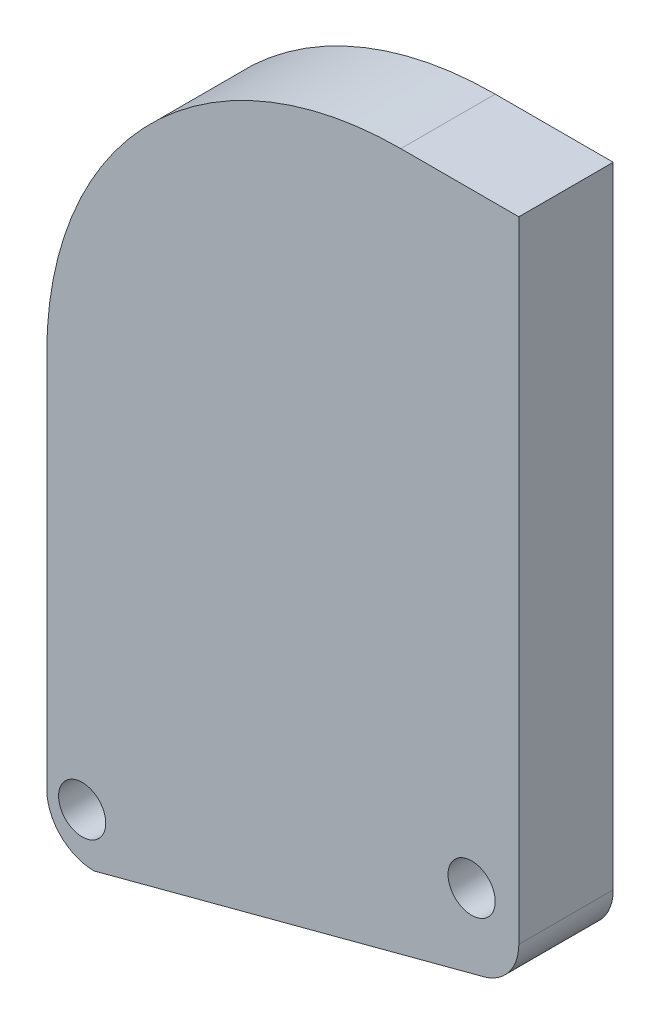
ISO-10303-21;
HEADER;
FILE_DESCRIPTION(('STEP AP214'),'2;1');
FILE_NAME('part.step','',(''),(''),'','','');
FILE_SCHEMA(('AUTOMOTIVE_DESIGN { 1 0 10303 214 1 1 1 1 }'));
ENDSEC;
DATA;
#1=APPLICATION_CONTEXT('core data for automotive mechanical design processes');
#2=APPLICATION_PROTOCOL_DEFINITION('international standard','automotive_design',2000,#1);
#3=PRODUCT_CONTEXT('',#1,'mechanical');
#4=PRODUCT('Part','Part','',(#3));
#5=PRODUCT_RELATED_PRODUCT_CATEGORY('part','',(#4));
#6=PRODUCT_DEFINITION_FORMATION('','',#4);
#7=PRODUCT_DEFINITION_CONTEXT('part definition',#1,'design');
#8=PRODUCT_DEFINITION('design','',#6,#7);
#9=PRODUCT_DEFINITION_SHAPE('','',#8);
#10=(LENGTH_UNIT() NAMED_UNIT(*) SI_UNIT(.MILLI.,.METRE.));
#11=(NAMED_UNIT(*) PLANE_ANGLE_UNIT() SI_UNIT($,.RADIAN.));
#12=(NAMED_UNIT(*) SI_UNIT($,.STERADIAN.) SOLID_ANGLE_UNIT());
#13=UNCERTAINTY_MEASURE_WITH_UNIT(LENGTH_MEASURE(1.E-05),#10,'distance_accuracy_value','');
#14=(GEOMETRIC_REPRESENTATION_CONTEXT(3) GLOBAL_UNCERTAINTY_ASSIGNED_CONTEXT((#13)) GLOBAL_UNIT_ASSIGNED_CONTEXT((#10,
#11,#12)) REPRESENTATION_CONTEXT('',''));
#15=CARTESIAN_POINT('',(0.,0.,0.));
#16=DIRECTION('',(0.,0.,1.));
#17=DIRECTION('',(1.,0.,0.));
#18=AXIS2_PLACEMENT_3D('',#15,#16,#17);
#19=CARTESIAN_POINT('',(-2.,-26.6942177390464,4.));
#20=DIRECTION('',(0.,0.,-1.));
#21=DIRECTION('',(-1.,0.,0.));
#22=AXIS2_PLACEMENT_3D('',#19,#20,#21);
#23=CYLINDRICAL_SURFACE('',#22,2.);
#24=CARTESIAN_POINT('',(-2.,-26.6942177390464,0.));
#25=DIRECTION('',(0.,0.,1.));
#26=DIRECTION('',(1.,0.,0.));
#27=AXIS2_PLACEMENT_3D('',#24,#25,#26);
#28=CIRCLE('',#27,2.);
#29=CARTESIAN_POINT('',(0.,-26.6942177390464,0.));
#30=VERTEX_POINT('',#29);
#31=CARTESIAN_POINT('',(-1.48803924182803,-28.6275816939427,0.));
#32=VERTEX_POINT('',#31);
#33=EDGE_CURVE('E129',#30,#32,#28,.F.);
#34=ORIENTED_EDGE('',*,*,#33,.F.);
#35=DIRECTION('',(0.,0.,-1.));
#36=VECTOR('',#35,1.);
#37=CARTESIAN_POINT('',(0.,-26.6942177390464,4.));
#38=LINE('',#37,#36);
#39=CARTESIAN_POINT('',(0.,-26.6942177390464,4.));
#40=VERTEX_POINT('',#39);
#41=EDGE_CURVE('E11',#40,#30,#38,.T.);
#42=ORIENTED_EDGE('',*,*,#41,.F.);
#43=CARTESIAN_POINT('',(-2.,-26.6942177390464,4.));
#44=DIRECTION('',(0.,0.,1.));
#45=DIRECTION('',(1.,0.,0.));
#46=AXIS2_PLACEMENT_3D('',#43,#44,#45);
#47=CIRCLE('',#46,2.);
#48=CARTESIAN_POINT('',(-1.48803924182803,-28.6275816939427,4.));
#49=VERTEX_POINT('',#48);
#50=EDGE_CURVE('E171',#40,#49,#47,.F.);
#51=ORIENTED_EDGE('',*,*,#50,.T.);
#52=DIRECTION('',(0.,0.,-1.));
#53=VECTOR('',#52,1.);
#54=CARTESIAN_POINT('',(-1.48803924182803,-28.6275816939427,4.));
#55=LINE('',#54,#53);
#56=EDGE_CURVE('E83',#49,#32,#55,.T.);
#57=ORIENTED_EDGE('',*,*,#56,.T.);
#58=EDGE_LOOP('',(#34,#42,#51,#57));
#59=FACE_BOUND('',#58,.T.);
#60=ADVANCED_FACE('F35',(#59),#23,.T.);
#61=CARTESIAN_POINT('',(0.,0.,4.));
#62=DIRECTION('',(1.,0.,0.));
#63=DIRECTION('',(0.,1.,0.));
#64=AXIS2_PLACEMENT_3D('',#61,#62,#63);
#65=PLANE('',#64);
#66=DIRECTION('',(0.,-1.,0.));
#67=VECTOR('',#66,1.);
#68=CARTESIAN_POINT('',(0.,0.,0.));
#69=LINE('',#68,#67);
#70=CARTESIAN_POINT('',(0.,0.,0.));
#71=VERTEX_POINT('',#70);
#72=EDGE_CURVE('E132',#71,#30,#69,.T.);
#73=ORIENTED_EDGE('',*,*,#72,.F.);
#74=DIRECTION('',(0.,0.,-1.));
#75=VECTOR('',#74,1.);
#76=CARTESIAN_POINT('',(0.,0.,4.));
#77=LINE('',#76,#75);
#78=CARTESIAN_POINT('',(0.,0.,4.));
#79=VERTEX_POINT('',#78);
#80=EDGE_CURVE('E44',#79,#71,#77,.T.);
#81=ORIENTED_EDGE('',*,*,#80,.F.);
#82=DIRECTION('',(0.,-1.,0.));
#83=VECTOR('',#82,1.);
#84=CARTESIAN_POINT('',(0.,0.,4.));
#85=LINE('',#84,#83);
#86=EDGE_CURVE('E169',#79,#40,#85,.T.);
#87=ORIENTED_EDGE('',*,*,#86,.T.);
#88=ORIENTED_EDGE('',*,*,#41,.T.);
#89=EDGE_LOOP('',(#73,#81,#87,#88));
#90=FACE_BOUND('',#89,.T.);
#91=ADVANCED_FACE('F168',(#90),#65,.T.);
#92=CARTESIAN_POINT('',(0.,0.,4.));
#93=DIRECTION('',(0.,-1.,0.));
#94=DIRECTION('',(0.,0.,-1.));
#95=AXIS2_PLACEMENT_3D('',#92,#93,#94);
#96=PLANE('',#95);
#97=DIRECTION('',(-1.,0.,0.));
#98=VECTOR('',#97,1.);
#99=CARTESIAN_POINT('',(0.,0.,0.));
#100=LINE('',#99,#98);
#101=CARTESIAN_POINT('',(-5.,0.,0.));
#102=VERTEX_POINT('',#101);
#103=EDGE_CURVE('E135',#71,#102,#100,.T.);
#104=ORIENTED_EDGE('',*,*,#103,.T.);
#105=DIRECTION('',(0.,0.,-1.));
#106=VECTOR('',#105,1.);
#107=CARTESIAN_POINT('',(-5.,0.,4.));
#108=LINE('',#107,#106);
#109=CARTESIAN_POINT('',(-5.,0.,4.));
#110=VERTEX_POINT('',#109);
#111=EDGE_CURVE('E153',#110,#102,#108,.T.);
#112=ORIENTED_EDGE('',*,*,#111,.F.);
#113=DIRECTION('',(-1.,0.,0.));
#114=VECTOR('',#113,1.);
#115=CARTESIAN_POINT('',(0.,0.,4.));
#116=LINE('',#115,#114);
#117=EDGE_CURVE('E160',#79,#110,#116,.T.);
#118=ORIENTED_EDGE('',*,*,#117,.F.);
#119=ORIENTED_EDGE('',*,*,#80,.T.);
#120=EDGE_LOOP('',(#104,#112,#118,#119));
#121=FACE_BOUND('',#120,.T.);
#122=ADVANCED_FACE('F158',(#121),#96,.F.);
#123=CARTESIAN_POINT('',(-5.,-15.,4.));
#124=DIRECTION('',(0.,0.,-1.));
#125=DIRECTION('',(-1.,0.,0.));
#126=AXIS2_PLACEMENT_3D('',#123,#124,#125);
#127=CYLINDRICAL_SURFACE('',#126,15.);
#128=CARTESIAN_POINT('',(-5.,-15.,0.));
#129=DIRECTION('',(0.,0.,1.));
#130=DIRECTION('',(1.,0.,0.));
#131=AXIS2_PLACEMENT_3D('',#128,#129,#130);
#132=CIRCLE('',#131,15.);
#133=CARTESIAN_POINT('',(-20.,-15.,0.));
#134=VERTEX_POINT('',#133);
#135=EDGE_CURVE('E138',#102,#134,#132,.T.);
#136=ORIENTED_EDGE('',*,*,#135,.T.);
#137=DIRECTION('',(0.,0.,-1.));
#138=VECTOR('',#137,1.);
#139=CARTESIAN_POINT('',(-20.,-15.,4.));
#140=LINE('',#139,#138);
#141=CARTESIAN_POINT('',(-20.,-15.,4.));
#142=VERTEX_POINT('',#141);
#143=EDGE_CURVE('E116',#142,#134,#140,.T.);
#144=ORIENTED_EDGE('',*,*,#143,.F.);
#145=CARTESIAN_POINT('',(-5.,-15.,4.));
#146=DIRECTION('',(0.,0.,1.));
#147=DIRECTION('',(1.,0.,0.));
#148=AXIS2_PLACEMENT_3D('',#145,#146,#147);
#149=CIRCLE('',#148,15.);
#150=EDGE_CURVE('E104',#110,#142,#149,.T.);
#151=ORIENTED_EDGE('',*,*,#150,.F.);
#152=ORIENTED_EDGE('',*,*,#111,.T.);
#153=EDGE_LOOP('',(#136,#144,#151,#152));
#154=FACE_BOUND('',#153,.T.);
#155=ADVANCED_FACE('F178',(#154),#127,.T.);
#156=CARTESIAN_POINT('',(-20.,0.,4.));
#157=DIRECTION('',(1.,0.,0.));
#158=DIRECTION('',(0.,0.,-1.));
#159=AXIS2_PLACEMENT_3D('',#156,#157,#158);
#160=PLANE('',#159);
#161=DIRECTION('',(0.,-1.,0.));
#162=VECTOR('',#161,1.);
#163=CARTESIAN_POINT('',(-20.,0.,0.));
#164=LINE('',#163,#162);
#165=CARTESIAN_POINT('',(-20.,-31.,0.));
#166=VERTEX_POINT('',#165);
#167=EDGE_CURVE('E112',#134,#166,#164,.T.);
#168=ORIENTED_EDGE('',*,*,#167,.T.);
#169=DIRECTION('',(0.,0.,-1.));
#170=VECTOR('',#169,1.);
#171=CARTESIAN_POINT('',(-20.,-31.,4.));
#172=LINE('',#171,#170);
#173=CARTESIAN_POINT('',(-20.,-31.,4.));
#174=VERTEX_POINT('',#173);
#175=EDGE_CURVE('E110',#174,#166,#172,.T.);
#176=ORIENTED_EDGE('',*,*,#175,.F.);
#177=DIRECTION('',(0.,-1.,0.));
#178=VECTOR('',#177,1.);
#179=CARTESIAN_POINT('',(-20.,0.,4.));
#180=LINE('',#179,#178);
#181=EDGE_CURVE('E97',#142,#174,#180,.T.);
#182=ORIENTED_EDGE('',*,*,#181,.F.);
#183=ORIENTED_EDGE('',*,*,#143,.T.);
#184=EDGE_LOOP('',(#168,#176,#182,#183));
#185=FACE_BOUND('',#184,.T.);
#186=ADVANCED_FACE('F111',(#185),#160,.F.);
#187=CARTESIAN_POINT('',(-18.,-31.,4.));
#188=DIRECTION('',(0.,0.,-1.));
#189=DIRECTION('',(-1.,0.,0.));
#190=AXIS2_PLACEMENT_3D('',#187,#188,#189);
#191=CYLINDRICAL_SURFACE('',#190,2.);
#192=CARTESIAN_POINT('',(-18.,-31.,0.));
#193=DIRECTION('',(0.,0.,1.));
#194=DIRECTION('',(1.,0.,0.));
#195=AXIS2_PLACEMENT_3D('',#192,#193,#194);
#196=CIRCLE('',#195,2.);
#197=CARTESIAN_POINT('',(-18.,-33.,0.));
#198=VERTEX_POINT('',#197);
#199=EDGE_CURVE('E142',#198,#166,#196,.F.);
#200=ORIENTED_EDGE('',*,*,#199,.F.);
#201=DIRECTION('',(0.,0.,-1.));
#202=VECTOR('',#201,1.);
#203=CARTESIAN_POINT('',(-18.,-33.,4.));
#204=LINE('',#203,#202);
#205=CARTESIAN_POINT('',(-18.,-33.,4.));
#206=VERTEX_POINT('',#205);
#207=EDGE_CURVE('E76',#206,#198,#204,.T.);
#208=ORIENTED_EDGE('',*,*,#207,.F.);
#209=CARTESIAN_POINT('',(-18.,-31.,4.));
#210=DIRECTION('',(0.,0.,1.));
#211=DIRECTION('',(1.,0.,0.));
#212=AXIS2_PLACEMENT_3D('',#209,#210,#211);
#213=CIRCLE('',#212,2.);
#214=EDGE_CURVE('E102',#206,#174,#213,.F.);
#215=ORIENTED_EDGE('',*,*,#214,.T.);
#216=ORIENTED_EDGE('',*,*,#175,.T.);
#217=EDGE_LOOP('',(#200,#208,#215,#216));
#218=FACE_BOUND('',#217,.T.);
#219=ADVANCED_FACE('F118',(#218),#191,.T.);
#220=CARTESIAN_POINT('',(6.98643624782499,-26.3835143594891,4.));
#221=DIRECTION('',(-0.255980379085988,0.966681977448113,0.));
#222=DIRECTION('',(-0.966681977448113,-0.255980379085988,0.));
#223=AXIS2_PLACEMENT_3D('',#220,#221,#222);
#224=PLANE('',#223);
#225=DIRECTION('',(0.966681977448113,0.255980379085988,0.));
#226=VECTOR('',#225,1.);
#227=CARTESIAN_POINT('',(6.98643624782499,-26.3835143594891,0.));
#228=LINE('',#227,#226);
#229=EDGE_CURVE('E144',#198,#32,#228,.T.);
#230=ORIENTED_EDGE('',*,*,#229,.T.);
#231=ORIENTED_EDGE('',*,*,#56,.F.);
#232=DIRECTION('',(0.966681977448113,0.255980379085988,0.));
#233=VECTOR('',#232,1.);
#234=CARTESIAN_POINT('',(6.98643624782499,-26.3835143594891,4.));
#235=LINE('',#234,#233);
#236=EDGE_CURVE('E52',#206,#49,#235,.T.);
#237=ORIENTED_EDGE('',*,*,#236,.F.);
#238=ORIENTED_EDGE('',*,*,#207,.T.);
#239=EDGE_LOOP('',(#230,#231,#237,#238));
#240=FACE_BOUND('',#239,.T.);
#241=ADVANCED_FACE('F170',(#240),#224,.F.);
#242=CARTESIAN_POINT('',(-2.,-25.6284327277001,4.));
#243=DIRECTION('',(0.,0.,-1.));
#244=DIRECTION('',(-1.,0.,0.));
#245=AXIS2_PLACEMENT_3D('',#242,#243,#244);
#246=CYLINDRICAL_SURFACE('',#245,1.);
#247=CARTESIAN_POINT('',(-2.,-25.6284327277001,4.));
#248=DIRECTION('',(0.,0.,1.));
#249=DIRECTION('',(1.,0.,0.));
#250=AXIS2_PLACEMENT_3D('',#247,#248,#249);
#251=CIRCLE('',#250,1.);
#252=CARTESIAN_POINT('',(-0.999999999999996,-25.6284327277001,4.));
#253=VERTEX_POINT('',#252);
#254=EDGE_CURVE('E149',#253,#253,#251,.T.);
#255=ORIENTED_EDGE('',*,*,#254,.T.);
#256=EDGE_LOOP('',(#255));
#257=FACE_BOUND('',#256,.T.);
#258=CARTESIAN_POINT('',(-2.,-25.6284327277001,0.));
#259=DIRECTION('',(0.,0.,1.));
#260=DIRECTION('',(1.,0.,0.));
#261=AXIS2_PLACEMENT_3D('',#258,#259,#260);
#262=CIRCLE('',#261,1.);
#263=CARTESIAN_POINT('',(-0.999999999999996,-25.6284327277001,0.));
#264=VERTEX_POINT('',#263);
#265=EDGE_CURVE('E126',#264,#264,#262,.T.);
#266=ORIENTED_EDGE('',*,*,#265,.F.);
#267=EDGE_LOOP('',(#266));
#268=FACE_BOUND('',#267,.T.);
#269=ADVANCED_FACE('F37',(#257,#268),#246,.F.);
#270=CARTESIAN_POINT('',(-18.5,-31.,4.));
#271=DIRECTION('',(0.,0.,-1.));
#272=DIRECTION('',(-1.,0.,0.));
#273=AXIS2_PLACEMENT_3D('',#270,#271,#272);
#274=CYLINDRICAL_SURFACE('',#273,1.);
#275=CARTESIAN_POINT('',(-18.5,-31.,4.));
#276=DIRECTION('',(0.,0.,1.));
#277=DIRECTION('',(1.,0.,0.));
#278=AXIS2_PLACEMENT_3D('',#275,#276,#277);
#279=CIRCLE('',#278,1.);
#280=CARTESIAN_POINT('',(-17.5,-31.,4.));
#281=VERTEX_POINT('',#280);
#282=EDGE_CURVE('E120',#281,#281,#279,.T.);
#283=ORIENTED_EDGE('',*,*,#282,.T.);
#284=EDGE_LOOP('',(#283));
#285=FACE_BOUND('',#284,.T.);
#286=CARTESIAN_POINT('',(-18.5,-31.,0.));
#287=DIRECTION('',(0.,0.,1.));
#288=DIRECTION('',(1.,0.,0.));
#289=AXIS2_PLACEMENT_3D('',#286,#287,#288);
#290=CIRCLE('',#289,1.);
#291=CARTESIAN_POINT('',(-17.5,-31.,0.));
#292=VERTEX_POINT('',#291);
#293=EDGE_CURVE('E146',#292,#292,#290,.T.);
#294=ORIENTED_EDGE('',*,*,#293,.F.);
#295=EDGE_LOOP('',(#294));
#296=FACE_BOUND('',#295,.T.);
#297=ADVANCED_FACE('F233',(#285,#296),#274,.F.);
#298=CARTESIAN_POINT('',(0.,0.,4.));
#299=DIRECTION('',(0.,0.,1.));
#300=DIRECTION('',(1.,0.,0.));
#301=AXIS2_PLACEMENT_3D('',#298,#299,#300);
#302=PLANE('',#301);
#303=ORIENTED_EDGE('',*,*,#254,.F.);
#304=EDGE_LOOP('',(#303));
#305=FACE_BOUND('',#304,.T.);
#306=ORIENTED_EDGE('',*,*,#50,.F.);
#307=ORIENTED_EDGE('',*,*,#86,.F.);
#308=ORIENTED_EDGE('',*,*,#117,.T.);
#309=ORIENTED_EDGE('',*,*,#150,.T.);
#310=ORIENTED_EDGE('',*,*,#181,.T.);
#311=ORIENTED_EDGE('',*,*,#214,.F.);
#312=ORIENTED_EDGE('',*,*,#236,.T.);
#313=EDGE_LOOP('',(#306,#307,#308,#309,#310,#311,#312));
#314=FACE_BOUND('',#313,.T.);
#315=ORIENTED_EDGE('',*,*,#282,.F.);
#316=EDGE_LOOP('',(#315));
#317=FACE_BOUND('',#316,.T.);
#318=ADVANCED_FACE('F99',(#305,#314,#317),#302,.T.);
#319=CARTESIAN_POINT('',(0.,0.,0.));
#320=DIRECTION('',(0.,0.,1.));
#321=DIRECTION('',(1.,0.,0.));
#322=AXIS2_PLACEMENT_3D('',#319,#320,#321);
#323=PLANE('',#322);
#324=ORIENTED_EDGE('',*,*,#265,.T.);
#325=EDGE_LOOP('',(#324));
#326=FACE_BOUND('',#325,.T.);
#327=ORIENTED_EDGE('',*,*,#33,.T.);
#328=ORIENTED_EDGE('',*,*,#229,.F.);
#329=ORIENTED_EDGE('',*,*,#199,.T.);
#330=ORIENTED_EDGE('',*,*,#167,.F.);
#331=ORIENTED_EDGE('',*,*,#135,.F.);
#332=ORIENTED_EDGE('',*,*,#103,.F.);
#333=ORIENTED_EDGE('',*,*,#72,.T.);
#334=EDGE_LOOP('',(#327,#328,#329,#330,#331,#332,#333));
#335=FACE_BOUND('',#334,.T.);
#336=ORIENTED_EDGE('',*,*,#293,.T.);
#337=EDGE_LOOP('',(#336));
#338=FACE_BOUND('',#337,.T.);
#339=ADVANCED_FACE('F166',(#326,#335,#338),#323,.F.);
#340=CLOSED_SHELL('',(#60,#91,#122,#155,#186,#219,#241,#269,#297,#318,#339));
#341=MANIFOLD_SOLID_BREP('B2',#340);
#342=ADVANCED_BREP_SHAPE_REPRESENTATION('',(#18,#341),#14);
#343=SHAPE_DEFINITION_REPRESENTATION(#9,#342);
ENDSEC;
END-ISO-10303-21;
